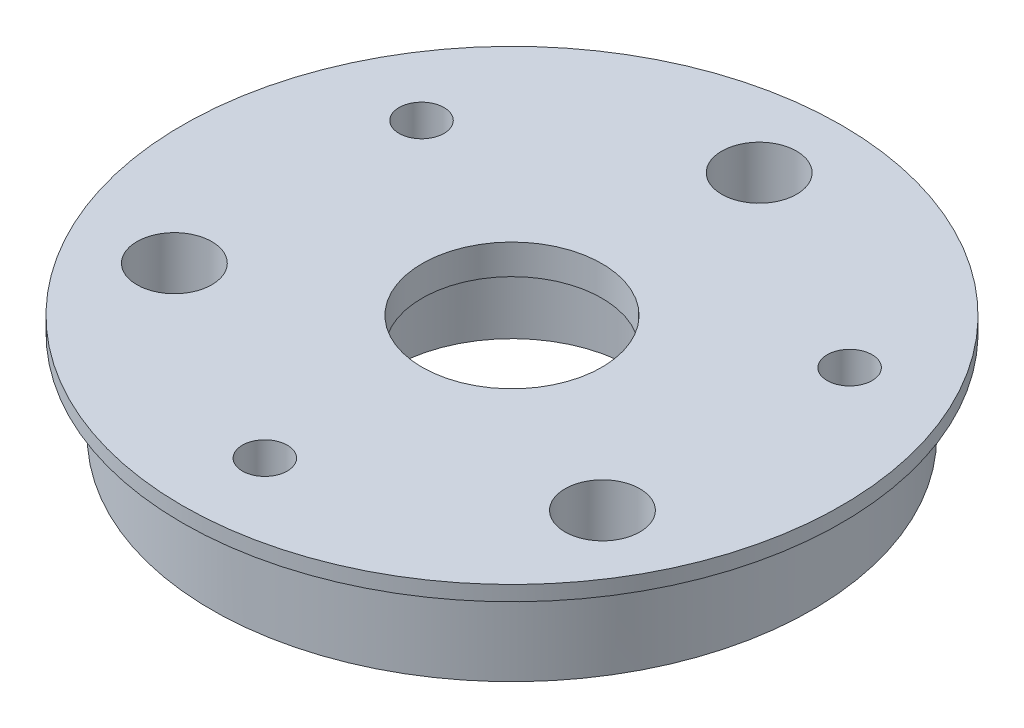
ISO-10303-21;
HEADER;
FILE_DESCRIPTION(('STEP AP214'),'2;1');
FILE_NAME('part.step','',(''),(''),'','','');
FILE_SCHEMA(('AUTOMOTIVE_DESIGN { 1 0 10303 214 1 1 1 1 }'));
ENDSEC;
DATA;
#1=APPLICATION_CONTEXT('core data for automotive mechanical design processes');
#2=APPLICATION_PROTOCOL_DEFINITION('international standard','automotive_design',2000,#1);
#3=PRODUCT_CONTEXT('',#1,'mechanical');
#4=PRODUCT('Part','Part','',(#3));
#5=PRODUCT_RELATED_PRODUCT_CATEGORY('part','',(#4));
#6=PRODUCT_DEFINITION_FORMATION('','',#4);
#7=PRODUCT_DEFINITION_CONTEXT('part definition',#1,'design');
#8=PRODUCT_DEFINITION('design','',#6,#7);
#9=PRODUCT_DEFINITION_SHAPE('','',#8);
#10=(LENGTH_UNIT() NAMED_UNIT(*) SI_UNIT(.MILLI.,.METRE.));
#11=(NAMED_UNIT(*) PLANE_ANGLE_UNIT() SI_UNIT($,.RADIAN.));
#12=(NAMED_UNIT(*) SI_UNIT($,.STERADIAN.) SOLID_ANGLE_UNIT());
#13=UNCERTAINTY_MEASURE_WITH_UNIT(LENGTH_MEASURE(1.E-05),#10,'distance_accuracy_value','');
#14=(GEOMETRIC_REPRESENTATION_CONTEXT(3) GLOBAL_UNCERTAINTY_ASSIGNED_CONTEXT((#13)) GLOBAL_UNIT_ASSIGNED_CONTEXT((#10,
#11,#12)) REPRESENTATION_CONTEXT('',''));
#15=CARTESIAN_POINT('',(0.,0.,0.));
#16=DIRECTION('',(0.,0.,1.));
#17=DIRECTION('',(1.,0.,0.));
#18=AXIS2_PLACEMENT_3D('',#15,#16,#17);
#19=CARTESIAN_POINT('',(0.,8.,0.));
#20=DIRECTION('',(0.,-1.,0.));
#21=DIRECTION('',(0.,0.,-1.));
#22=AXIS2_PLACEMENT_3D('',#19,#20,#21);
#23=CYLINDRICAL_SURFACE('',#22,20.05);
#24=CARTESIAN_POINT('',(0.,14.,0.));
#25=DIRECTION('',(0.,1.,0.));
#26=DIRECTION('',(0.,0.,1.));
#27=AXIS2_PLACEMENT_3D('',#24,#25,#26);
#28=CIRCLE('',#27,20.05);
#29=CARTESIAN_POINT('',(0.,14.,20.05));
#30=VERTEX_POINT('',#29);
#31=EDGE_CURVE('E10',#30,#30,#28,.T.);
#32=ORIENTED_EDGE('',*,*,#31,.F.);
#33=EDGE_LOOP('',(#32));
#34=FACE_BOUND('',#33,.T.);
#35=CARTESIAN_POINT('',(0.,8.,0.));
#36=DIRECTION('',(0.,-1.,0.));
#37=DIRECTION('',(0.,0.,-1.));
#38=AXIS2_PLACEMENT_3D('',#35,#36,#37);
#39=CIRCLE('',#38,20.05);
#40=CARTESIAN_POINT('',(0.,8.,-20.05));
#41=VERTEX_POINT('',#40);
#42=EDGE_CURVE('E84',#41,#41,#39,.T.);
#43=ORIENTED_EDGE('',*,*,#42,.F.);
#44=EDGE_LOOP('',(#43));
#45=FACE_BOUND('',#44,.T.);
#46=ADVANCED_FACE('F36',(#34,#45),#23,.T.);
#47=CARTESIAN_POINT('',(0.,8.,0.));
#48=DIRECTION('',(0.,-1.,0.));
#49=DIRECTION('',(0.,0.,-1.));
#50=AXIS2_PLACEMENT_3D('',#47,#48,#49);
#51=CYLINDRICAL_SURFACE('',#50,8.);
#52=CARTESIAN_POINT('',(0.,13.,0.));
#53=DIRECTION('',(0.,1.,0.));
#54=DIRECTION('',(0.,0.,1.));
#55=AXIS2_PLACEMENT_3D('',#52,#53,#54);
#56=CIRCLE('',#55,8.);
#57=CARTESIAN_POINT('',(0.,13.,8.));
#58=VERTEX_POINT('',#57);
#59=EDGE_CURVE('E44',#58,#58,#56,.T.);
#60=ORIENTED_EDGE('',*,*,#59,.T.);
#61=EDGE_LOOP('',(#60));
#62=FACE_BOUND('',#61,.T.);
#63=CARTESIAN_POINT('',(0.,8.,0.));
#64=DIRECTION('',(0.,-1.,0.));
#65=DIRECTION('',(0.,0.,-1.));
#66=AXIS2_PLACEMENT_3D('',#63,#64,#65);
#67=CIRCLE('',#66,8.);
#68=CARTESIAN_POINT('',(0.,8.,-8.));
#69=VERTEX_POINT('',#68);
#70=EDGE_CURVE('E88',#69,#69,#67,.F.);
#71=ORIENTED_EDGE('',*,*,#70,.F.);
#72=EDGE_LOOP('',(#71));
#73=FACE_BOUND('',#72,.T.);
#74=ADVANCED_FACE('F38',(#62,#73),#51,.F.);
#75=CARTESIAN_POINT('',(-14.2894191624432,0.,-8.25000000000007));
#76=DIRECTION('',(0.,1.,0.));
#77=DIRECTION('',(0.,0.,1.));
#78=AXIS2_PLACEMENT_3D('',#75,#76,#77);
#79=CYLINDRICAL_SURFACE('',#78,1.5);
#80=CARTESIAN_POINT('',(-14.2894191624432,15.,-8.25000000000007));
#81=DIRECTION('',(0.,1.,0.));
#82=DIRECTION('',(0.,0.,1.));
#83=AXIS2_PLACEMENT_3D('',#80,#81,#82);
#84=CIRCLE('',#83,1.5);
#85=CARTESIAN_POINT('',(-14.2894191624432,15.,-6.75000000000007));
#86=VERTEX_POINT('',#85);
#87=EDGE_CURVE('E70',#86,#86,#84,.T.);
#88=ORIENTED_EDGE('',*,*,#87,.T.);
#89=EDGE_LOOP('',(#88));
#90=FACE_BOUND('',#89,.T.);
#91=CARTESIAN_POINT('',(-14.2894191624432,8.,-8.25000000000007));
#92=DIRECTION('',(0.,-1.,0.));
#93=DIRECTION('',(0.,0.,-1.));
#94=AXIS2_PLACEMENT_3D('',#91,#92,#93);
#95=CIRCLE('',#94,1.5);
#96=CARTESIAN_POINT('',(-14.2894191624432,8.,-9.75000000000007));
#97=VERTEX_POINT('',#96);
#98=EDGE_CURVE('E104',#97,#97,#95,.F.);
#99=ORIENTED_EDGE('',*,*,#98,.F.);
#100=EDGE_LOOP('',(#99));
#101=FACE_BOUND('',#100,.T.);
#102=ADVANCED_FACE('F133',(#90,#101),#79,.F.);
#103=CARTESIAN_POINT('',(0.,0.,16.5));
#104=DIRECTION('',(0.,1.,0.));
#105=DIRECTION('',(0.,0.,1.));
#106=AXIS2_PLACEMENT_3D('',#103,#104,#105);
#107=CYLINDRICAL_SURFACE('',#106,1.5);
#108=CARTESIAN_POINT('',(0.,15.,16.5));
#109=DIRECTION('',(0.,1.,0.));
#110=DIRECTION('',(0.,0.,1.));
#111=AXIS2_PLACEMENT_3D('',#108,#109,#110);
#112=CIRCLE('',#111,1.5);
#113=CARTESIAN_POINT('',(0.,15.,18.));
#114=VERTEX_POINT('',#113);
#115=EDGE_CURVE('E67',#114,#114,#112,.T.);
#116=ORIENTED_EDGE('',*,*,#115,.T.);
#117=EDGE_LOOP('',(#116));
#118=FACE_BOUND('',#117,.T.);
#119=CARTESIAN_POINT('',(0.,8.,16.5));
#120=DIRECTION('',(0.,-1.,0.));
#121=DIRECTION('',(0.,0.,-1.));
#122=AXIS2_PLACEMENT_3D('',#119,#120,#121);
#123=CIRCLE('',#122,1.5);
#124=CARTESIAN_POINT('',(0.,8.,15.));
#125=VERTEX_POINT('',#124);
#126=EDGE_CURVE('E110',#125,#125,#123,.F.);
#127=ORIENTED_EDGE('',*,*,#126,.F.);
#128=EDGE_LOOP('',(#127));
#129=FACE_BOUND('',#128,.T.);
#130=ADVANCED_FACE('F123',(#118,#129),#107,.F.);
#131=CARTESIAN_POINT('',(14.2894191624433,0.,-8.24999999999986));
#132=DIRECTION('',(0.,1.,0.));
#133=DIRECTION('',(0.,0.,1.));
#134=AXIS2_PLACEMENT_3D('',#131,#132,#133);
#135=CYLINDRICAL_SURFACE('',#134,1.5);
#136=CARTESIAN_POINT('',(14.2894191624433,15.,-8.24999999999986));
#137=DIRECTION('',(0.,1.,0.));
#138=DIRECTION('',(0.,0.,1.));
#139=AXIS2_PLACEMENT_3D('',#136,#137,#138);
#140=CIRCLE('',#139,1.5);
#141=CARTESIAN_POINT('',(14.2894191624433,15.,-6.74999999999987));
#142=VERTEX_POINT('',#141);
#143=EDGE_CURVE('E73',#142,#142,#140,.T.);
#144=ORIENTED_EDGE('',*,*,#143,.T.);
#145=EDGE_LOOP('',(#144));
#146=FACE_BOUND('',#145,.T.);
#147=CARTESIAN_POINT('',(14.2894191624433,8.,-8.24999999999986));
#148=DIRECTION('',(0.,-1.,0.));
#149=DIRECTION('',(0.,0.,-1.));
#150=AXIS2_PLACEMENT_3D('',#147,#148,#149);
#151=CIRCLE('',#150,1.5);
#152=CARTESIAN_POINT('',(14.2894191624433,8.,-9.74999999999986));
#153=VERTEX_POINT('',#152);
#154=EDGE_CURVE('E113',#153,#153,#151,.F.);
#155=ORIENTED_EDGE('',*,*,#154,.F.);
#156=EDGE_LOOP('',(#155));
#157=FACE_BOUND('',#156,.T.);
#158=ADVANCED_FACE('F120',(#146,#157),#135,.F.);
#159=CARTESIAN_POINT('',(14.2894191624432,0.,8.25));
#160=DIRECTION('',(0.,1.,0.));
#161=DIRECTION('',(0.,0.,1.));
#162=AXIS2_PLACEMENT_3D('',#159,#160,#161);
#163=CYLINDRICAL_SURFACE('',#162,2.5);
#164=CARTESIAN_POINT('',(14.2894191624432,15.,8.25));
#165=DIRECTION('',(0.,1.,0.));
#166=DIRECTION('',(0.,0.,1.));
#167=AXIS2_PLACEMENT_3D('',#164,#165,#166);
#168=CIRCLE('',#167,2.5);
#169=CARTESIAN_POINT('',(14.2894191624432,15.,10.75));
#170=VERTEX_POINT('',#169);
#171=EDGE_CURVE('E66',#170,#170,#168,.T.);
#172=ORIENTED_EDGE('',*,*,#171,.T.);
#173=EDGE_LOOP('',(#172));
#174=FACE_BOUND('',#173,.T.);
#175=CARTESIAN_POINT('',(14.2894191624433,8.,8.24999999999993));
#176=DIRECTION('',(0.,-1.,0.));
#177=DIRECTION('',(-0.866025403784436,0.,0.500000000000004));
#178=AXIS2_PLACEMENT_3D('',#175,#176,#177);
#179=CIRCLE('',#178,2.5);
#180=CARTESIAN_POINT('',(12.1243556529822,8.,9.49999999999994));
#181=VERTEX_POINT('',#180);
#182=EDGE_CURVE('E92',#181,#181,#179,.F.);
#183=ORIENTED_EDGE('',*,*,#182,.F.);
#184=EDGE_LOOP('',(#183));
#185=FACE_BOUND('',#184,.T.);
#186=ADVANCED_FACE('F122',(#174,#185),#163,.F.);
#187=CARTESIAN_POINT('',(0.,0.,-16.5));
#188=DIRECTION('',(0.,1.,0.));
#189=DIRECTION('',(0.,0.,1.));
#190=AXIS2_PLACEMENT_3D('',#187,#188,#189);
#191=CYLINDRICAL_SURFACE('',#190,2.5);
#192=CARTESIAN_POINT('',(0.,15.,-16.5));
#193=DIRECTION('',(0.,1.,0.));
#194=DIRECTION('',(0.,0.,1.));
#195=AXIS2_PLACEMENT_3D('',#192,#193,#194);
#196=CIRCLE('',#195,2.5);
#197=CARTESIAN_POINT('',(0.,15.,-14.));
#198=VERTEX_POINT('',#197);
#199=EDGE_CURVE('E61',#198,#198,#196,.T.);
#200=ORIENTED_EDGE('',*,*,#199,.T.);
#201=EDGE_LOOP('',(#200));
#202=FACE_BOUND('',#201,.T.);
#203=CARTESIAN_POINT('',(-1.59594559789866E-13,8.,-16.5));
#204=DIRECTION('',(0.,-1.,0.));
#205=DIRECTION('',(0.866025403784443,0.,0.499999999999992));
#206=AXIS2_PLACEMENT_3D('',#203,#204,#205);
#207=CIRCLE('',#206,2.5);
#208=CARTESIAN_POINT('',(2.16506350946095,8.,-15.25));
#209=VERTEX_POINT('',#208);
#210=EDGE_CURVE('E93',#209,#209,#207,.F.);
#211=ORIENTED_EDGE('',*,*,#210,.F.);
#212=EDGE_LOOP('',(#211));
#213=FACE_BOUND('',#212,.T.);
#214=ADVANCED_FACE('F130',(#202,#213),#191,.F.);
#215=CARTESIAN_POINT('',(-14.2894191624432,0.,8.25000000000001));
#216=DIRECTION('',(0.,1.,0.));
#217=DIRECTION('',(0.,0.,1.));
#218=AXIS2_PLACEMENT_3D('',#215,#216,#217);
#219=CYLINDRICAL_SURFACE('',#218,2.5);
#220=CARTESIAN_POINT('',(-14.2894191624432,15.,8.25000000000001));
#221=DIRECTION('',(0.,1.,0.));
#222=DIRECTION('',(0.,0.,1.));
#223=AXIS2_PLACEMENT_3D('',#220,#221,#222);
#224=CIRCLE('',#223,2.5);
#225=CARTESIAN_POINT('',(-14.2894191624432,15.,10.75));
#226=VERTEX_POINT('',#225);
#227=EDGE_CURVE('E63',#226,#226,#224,.T.);
#228=ORIENTED_EDGE('',*,*,#227,.T.);
#229=EDGE_LOOP('',(#228));
#230=FACE_BOUND('',#229,.T.);
#231=CARTESIAN_POINT('',(-14.2894191624432,8.,8.25000000000001));
#232=DIRECTION('',(0.,-1.,0.));
#233=DIRECTION('',(0.,0.,-1.));
#234=AXIS2_PLACEMENT_3D('',#231,#232,#233);
#235=CIRCLE('',#234,2.5);
#236=CARTESIAN_POINT('',(-14.2894191624432,8.,5.75000000000001));
#237=VERTEX_POINT('',#236);
#238=EDGE_CURVE('E78',#237,#237,#235,.F.);
#239=ORIENTED_EDGE('',*,*,#238,.F.);
#240=EDGE_LOOP('',(#239));
#241=FACE_BOUND('',#240,.T.);
#242=ADVANCED_FACE('F148',(#230,#241),#219,.F.);
#243=CARTESIAN_POINT('',(0.,15.,0.));
#244=DIRECTION('',(0.,1.,0.));
#245=DIRECTION('',(0.,0.,1.));
#246=AXIS2_PLACEMENT_3D('',#243,#244,#245);
#247=PLANE('',#246);
#248=ORIENTED_EDGE('',*,*,#199,.F.);
#249=EDGE_LOOP('',(#248));
#250=FACE_BOUND('',#249,.T.);
#251=ORIENTED_EDGE('',*,*,#143,.F.);
#252=EDGE_LOOP('',(#251));
#253=FACE_BOUND('',#252,.T.);
#254=ORIENTED_EDGE('',*,*,#171,.F.);
#255=EDGE_LOOP('',(#254));
#256=FACE_BOUND('',#255,.T.);
#257=ORIENTED_EDGE('',*,*,#227,.F.);
#258=EDGE_LOOP('',(#257));
#259=FACE_BOUND('',#258,.T.);
#260=ORIENTED_EDGE('',*,*,#115,.F.);
#261=EDGE_LOOP('',(#260));
#262=FACE_BOUND('',#261,.T.);
#263=ORIENTED_EDGE('',*,*,#87,.F.);
#264=EDGE_LOOP('',(#263));
#265=FACE_BOUND('',#264,.T.);
#266=CARTESIAN_POINT('',(0.,15.,0.));
#267=DIRECTION('',(0.,1.,0.));
#268=DIRECTION('',(0.,0.,1.));
#269=AXIS2_PLACEMENT_3D('',#266,#267,#268);
#270=CIRCLE('',#269,6.);
#271=CARTESIAN_POINT('',(0.,15.,6.));
#272=VERTEX_POINT('',#271);
#273=EDGE_CURVE('E56',#272,#272,#270,.T.);
#274=ORIENTED_EDGE('',*,*,#273,.F.);
#275=EDGE_LOOP('',(#274));
#276=FACE_BOUND('',#275,.T.);
#277=CARTESIAN_POINT('',(0.,15.,0.));
#278=DIRECTION('',(0.,1.,0.));
#279=DIRECTION('',(0.,0.,1.));
#280=AXIS2_PLACEMENT_3D('',#277,#278,#279);
#281=CIRCLE('',#280,22.);
#282=CARTESIAN_POINT('',(0.,15.,22.));
#283=VERTEX_POINT('',#282);
#284=EDGE_CURVE('E101',#283,#283,#281,.T.);
#285=ORIENTED_EDGE('',*,*,#284,.T.);
#286=EDGE_LOOP('',(#285));
#287=FACE_BOUND('',#286,.T.);
#288=ADVANCED_FACE('F144',(#250,#253,#256,#259,#262,#265,#276,#287),#247,.T.);
#289=CARTESIAN_POINT('',(0.,13.,0.));
#290=DIRECTION('',(0.,1.,0.));
#291=DIRECTION('',(0.,0.,1.));
#292=AXIS2_PLACEMENT_3D('',#289,#290,#291);
#293=PLANE('',#292);
#294=CARTESIAN_POINT('',(0.,13.,0.));
#295=DIRECTION('',(0.,1.,0.));
#296=DIRECTION('',(0.,0.,1.));
#297=AXIS2_PLACEMENT_3D('',#294,#295,#296);
#298=CIRCLE('',#297,6.);
#299=CARTESIAN_POINT('',(0.,13.,6.));
#300=VERTEX_POINT('',#299);
#301=EDGE_CURVE('E51',#300,#300,#298,.T.);
#302=ORIENTED_EDGE('',*,*,#301,.T.);
#303=EDGE_LOOP('',(#302));
#304=FACE_BOUND('',#303,.T.);
#305=ORIENTED_EDGE('',*,*,#59,.F.);
#306=EDGE_LOOP('',(#305));
#307=FACE_BOUND('',#306,.T.);
#308=ADVANCED_FACE('F147',(#304,#307),#293,.F.);
#309=CARTESIAN_POINT('',(0.,13.,0.));
#310=DIRECTION('',(0.,1.,0.));
#311=DIRECTION('',(0.,0.,1.));
#312=AXIS2_PLACEMENT_3D('',#309,#310,#311);
#313=CYLINDRICAL_SURFACE('',#312,6.);
#314=ORIENTED_EDGE('',*,*,#301,.F.);
#315=EDGE_LOOP('',(#314));
#316=FACE_BOUND('',#315,.T.);
#317=ORIENTED_EDGE('',*,*,#273,.T.);
#318=EDGE_LOOP('',(#317));
#319=FACE_BOUND('',#318,.T.);
#320=ADVANCED_FACE('F152',(#316,#319),#313,.F.);
#321=CARTESIAN_POINT('',(0.,8.,0.));
#322=DIRECTION('',(0.,-1.,0.));
#323=DIRECTION('',(0.,0.,-1.));
#324=AXIS2_PLACEMENT_3D('',#321,#322,#323);
#325=PLANE('',#324);
#326=ORIENTED_EDGE('',*,*,#42,.T.);
#327=EDGE_LOOP('',(#326));
#328=FACE_BOUND('',#327,.T.);
#329=ORIENTED_EDGE('',*,*,#70,.T.);
#330=EDGE_LOOP('',(#329));
#331=FACE_BOUND('',#330,.T.);
#332=ORIENTED_EDGE('',*,*,#238,.T.);
#333=EDGE_LOOP('',(#332));
#334=FACE_BOUND('',#333,.T.);
#335=ORIENTED_EDGE('',*,*,#126,.T.);
#336=EDGE_LOOP('',(#335));
#337=FACE_BOUND('',#336,.T.);
#338=ORIENTED_EDGE('',*,*,#182,.T.);
#339=EDGE_LOOP('',(#338));
#340=FACE_BOUND('',#339,.T.);
#341=ORIENTED_EDGE('',*,*,#154,.T.);
#342=EDGE_LOOP('',(#341));
#343=FACE_BOUND('',#342,.T.);
#344=ORIENTED_EDGE('',*,*,#210,.T.);
#345=EDGE_LOOP('',(#344));
#346=FACE_BOUND('',#345,.T.);
#347=ORIENTED_EDGE('',*,*,#98,.T.);
#348=EDGE_LOOP('',(#347));
#349=FACE_BOUND('',#348,.T.);
#350=ADVANCED_FACE('F117',(#328,#331,#334,#337,#340,#343,#346,#349),#325,.T.);
#351=CARTESIAN_POINT('',(0.,14.,0.));
#352=DIRECTION('',(0.,1.,0.));
#353=DIRECTION('',(0.,0.,1.));
#354=AXIS2_PLACEMENT_3D('',#351,#352,#353);
#355=CYLINDRICAL_SURFACE('',#354,22.);
#356=CARTESIAN_POINT('',(0.,14.,0.));
#357=DIRECTION('',(0.,1.,0.));
#358=DIRECTION('',(0.,0.,1.));
#359=AXIS2_PLACEMENT_3D('',#356,#357,#358);
#360=CIRCLE('',#359,22.);
#361=CARTESIAN_POINT('',(0.,14.,22.));
#362=VERTEX_POINT('',#361);
#363=EDGE_CURVE('E97',#362,#362,#360,.T.);
#364=ORIENTED_EDGE('',*,*,#363,.T.);
#365=EDGE_LOOP('',(#364));
#366=FACE_BOUND('',#365,.T.);
#367=ORIENTED_EDGE('',*,*,#284,.F.);
#368=EDGE_LOOP('',(#367));
#369=FACE_BOUND('',#368,.T.);
#370=ADVANCED_FACE('F169',(#366,#369),#355,.T.);
#371=CARTESIAN_POINT('',(0.,14.,0.));
#372=DIRECTION('',(0.,1.,0.));
#373=DIRECTION('',(0.,0.,1.));
#374=AXIS2_PLACEMENT_3D('',#371,#372,#373);
#375=PLANE('',#374);
#376=ORIENTED_EDGE('',*,*,#31,.T.);
#377=EDGE_LOOP('',(#376));
#378=FACE_BOUND('',#377,.T.);
#379=ORIENTED_EDGE('',*,*,#363,.F.);
#380=EDGE_LOOP('',(#379));
#381=FACE_BOUND('',#380,.T.);
#382=ADVANCED_FACE('F175',(#378,#381),#375,.F.);
#383=CLOSED_SHELL('',(#46,#74,#102,#130,#158,#186,#214,#242,#288,#308,#320,#350,#370,#382));
#384=MANIFOLD_SOLID_BREP('B2',#383);
#385=ADVANCED_BREP_SHAPE_REPRESENTATION('',(#18,#384),#14);
#386=SHAPE_DEFINITION_REPRESENTATION(#9,#385);
ENDSEC;
END-ISO-10303-21;
